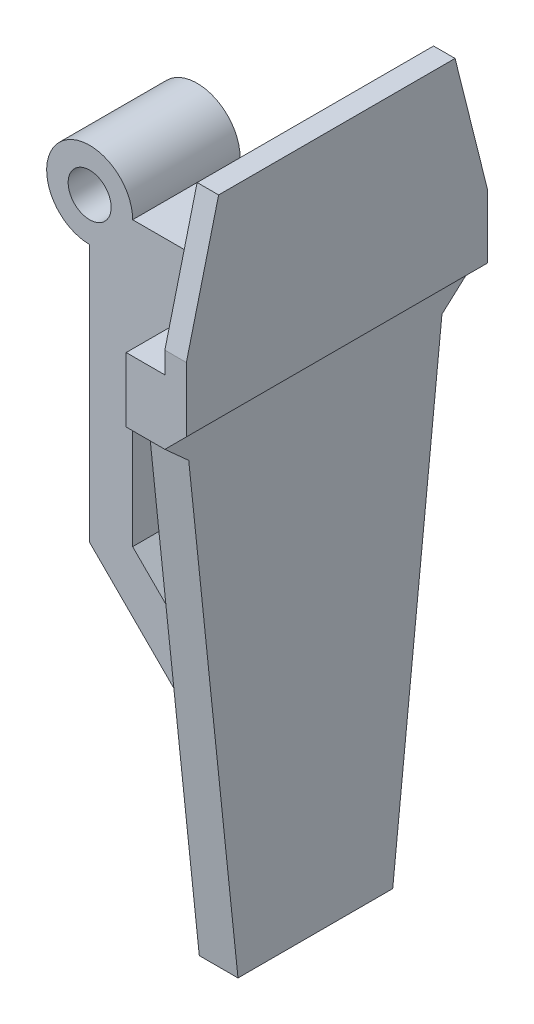
ISO-10303-21;
HEADER;
FILE_DESCRIPTION(('STEP AP214'),'2;1');
FILE_NAME('part.step','',(''),(''),'','','');
FILE_SCHEMA(('AUTOMOTIVE_DESIGN { 1 0 10303 214 1 1 1 1 }'));
ENDSEC;
DATA;
#1=APPLICATION_CONTEXT('core data for automotive mechanical design processes');
#2=APPLICATION_PROTOCOL_DEFINITION('international standard','automotive_design',2000,#1);
#3=PRODUCT_CONTEXT('',#1,'mechanical');
#4=PRODUCT('Part','Part','',(#3));
#5=PRODUCT_RELATED_PRODUCT_CATEGORY('part','',(#4));
#6=PRODUCT_DEFINITION_FORMATION('','',#4);
#7=PRODUCT_DEFINITION_CONTEXT('part definition',#1,'design');
#8=PRODUCT_DEFINITION('design','',#6,#7);
#9=PRODUCT_DEFINITION_SHAPE('','',#8);
#10=(LENGTH_UNIT() NAMED_UNIT(*) SI_UNIT(.MILLI.,.METRE.));
#11=(NAMED_UNIT(*) PLANE_ANGLE_UNIT() SI_UNIT($,.RADIAN.));
#12=(NAMED_UNIT(*) SI_UNIT($,.STERADIAN.) SOLID_ANGLE_UNIT());
#13=UNCERTAINTY_MEASURE_WITH_UNIT(LENGTH_MEASURE(1.E-05),#10,'distance_accuracy_value','');
#14=(GEOMETRIC_REPRESENTATION_CONTEXT(3) GLOBAL_UNCERTAINTY_ASSIGNED_CONTEXT((#13)) GLOBAL_UNIT_ASSIGNED_CONTEXT((#10,
#11,#12)) REPRESENTATION_CONTEXT('',''));
#15=CARTESIAN_POINT('',(0.,0.,0.));
#16=DIRECTION('',(0.,0.,1.));
#17=DIRECTION('',(1.,0.,0.));
#18=AXIS2_PLACEMENT_3D('',#15,#16,#17);
#19=CARTESIAN_POINT('',(60.4884324048631,0.,0.));
#20=DIRECTION('',(-1.,0.,0.));
#21=DIRECTION('',(0.,0.,1.));
#22=AXIS2_PLACEMENT_3D('',#19,#20,#21);
#23=PLANE('',#22);
#24=DIRECTION('',(0.,-1.,0.));
#25=VECTOR('',#24,1.);
#26=CARTESIAN_POINT('',(60.4884324048631,0.,-7.00000000000001));
#27=LINE('',#26,#25);
#28=CARTESIAN_POINT('',(60.4884324048631,-0.279472225827047,-7.00000000000001));
#29=VERTEX_POINT('',#28);
#30=CARTESIAN_POINT('',(60.4884324048631,-3.27947222582705,-7.00000000000001));
#31=VERTEX_POINT('',#30);
#32=EDGE_CURVE('E342',#29,#31,#27,.T.);
#33=ORIENTED_EDGE('',*,*,#32,.T.);
#34=DIRECTION('',(0.,-0.669475136110574,0.742834464823576));
#35=VECTOR('',#34,1.);
#36=CARTESIAN_POINT('',(60.4884324048631,-5.29078718190904,-4.7682904287187));
#37=LINE('',#36,#35);
#38=CARTESIAN_POINT('',(60.4884324048631,-4.27947222582705,-5.89042262399887));
#39=VERTEX_POINT('',#38);
#40=EDGE_CURVE('E490',#31,#39,#37,.T.);
#41=ORIENTED_EDGE('',*,*,#40,.T.);
#42=DIRECTION('',(0.,-0.994618408890778,0.103606084259456));
#43=VECTOR('',#42,1.);
#44=CARTESIAN_POINT('',(60.4884324048631,-0.652936125120399,-6.26818680115581));
#45=LINE('',#44,#43);
#46=CARTESIAN_POINT('',(60.4884324048631,-26.279472225827,-3.5987559573322));
#47=VERTEX_POINT('',#46);
#48=EDGE_CURVE('E493',#39,#47,#45,.T.);
#49=ORIENTED_EDGE('',*,*,#48,.T.);
#50=DIRECTION('',(0.,0.,1.));
#51=VECTOR('',#50,1.);
#52=CARTESIAN_POINT('',(60.4884324048631,-26.279472225827,0.));
#53=LINE('',#52,#51);
#54=CARTESIAN_POINT('',(60.4884324048631,-26.279472225827,3.5987559573322));
#55=VERTEX_POINT('',#54);
#56=EDGE_CURVE('E496',#47,#55,#53,.T.);
#57=ORIENTED_EDGE('',*,*,#56,.T.);
#58=DIRECTION('',(0.,0.994618408890778,0.103606084259456));
#59=VECTOR('',#58,1.);
#60=CARTESIAN_POINT('',(60.4884324048631,-0.652936125120396,6.2681868011558));
#61=LINE('',#60,#59);
#62=CARTESIAN_POINT('',(60.4884324048631,-4.27947222582705,5.89042262399886));
#63=VERTEX_POINT('',#62);
#64=EDGE_CURVE('E499',#55,#63,#61,.T.);
#65=ORIENTED_EDGE('',*,*,#64,.T.);
#66=DIRECTION('',(0.,-0.669475136110574,-0.742834464823576));
#67=VECTOR('',#66,1.);
#68=CARTESIAN_POINT('',(60.4884324048631,-5.29078718190904,4.7682904287187));
#69=LINE('',#68,#67);
#70=CARTESIAN_POINT('',(60.4884324048631,-3.27947222582705,7.));
#71=VERTEX_POINT('',#70);
#72=EDGE_CURVE('E482',#71,#63,#69,.T.);
#73=ORIENTED_EDGE('',*,*,#72,.F.);
#74=DIRECTION('',(0.,1.,0.));
#75=VECTOR('',#74,1.);
#76=CARTESIAN_POINT('',(60.4884324048631,0.,6.99999999999999));
#77=LINE('',#76,#75);
#78=CARTESIAN_POINT('',(60.4884324048631,-0.279472225827047,6.99999999999999));
#79=VERTEX_POINT('',#78);
#80=EDGE_CURVE('E346',#71,#79,#77,.T.);
#81=ORIENTED_EDGE('',*,*,#80,.T.);
#82=DIRECTION('',(0.,0.,1.));
#83=VECTOR('',#82,1.);
#84=CARTESIAN_POINT('',(60.4884324048631,-0.279472225827047,0.));
#85=LINE('',#84,#83);
#86=CARTESIAN_POINT('',(60.4884324048631,-0.279472225827047,2.5));
#87=VERTEX_POINT('',#86);
#88=EDGE_CURVE('E343',#87,#79,#85,.T.);
#89=ORIENTED_EDGE('',*,*,#88,.F.);
#90=DIRECTION('',(0.,-1.,0.));
#91=VECTOR('',#90,1.);
#92=CARTESIAN_POINT('',(60.4884324048631,0.,2.5));
#93=LINE('',#92,#91);
#94=CARTESIAN_POINT('',(60.4884324048631,-19.479472225827,2.5));
#95=VERTEX_POINT('',#94);
#96=EDGE_CURVE('E364',#87,#95,#93,.T.);
#97=ORIENTED_EDGE('',*,*,#96,.T.);
#98=DIRECTION('',(0.,0.,1.));
#99=VECTOR('',#98,1.);
#100=CARTESIAN_POINT('',(60.4884324048631,-19.479472225827,2.5));
#101=LINE('',#100,#99);
#102=CARTESIAN_POINT('',(60.4884324048631,-19.479472225827,-2.5));
#103=VERTEX_POINT('',#102);
#104=EDGE_CURVE('E361',#103,#95,#101,.T.);
#105=ORIENTED_EDGE('',*,*,#104,.F.);
#106=DIRECTION('',(0.,-1.,0.));
#107=VECTOR('',#106,1.);
#108=CARTESIAN_POINT('',(60.4884324048631,0.,-2.5));
#109=LINE('',#108,#107);
#110=CARTESIAN_POINT('',(60.4884324048631,-0.279472225827047,-2.5));
#111=VERTEX_POINT('',#110);
#112=EDGE_CURVE('E443',#111,#103,#109,.T.);
#113=ORIENTED_EDGE('',*,*,#112,.F.);
#114=EDGE_CURVE('E339',#29,#111,#85,.T.);
#115=ORIENTED_EDGE('',*,*,#114,.F.);
#116=EDGE_LOOP('',(#33,#41,#49,#57,#65,#73,#81,#89,#97,#105,#113,#115));
#117=FACE_BOUND('',#116,.T.);
#118=ADVANCED_FACE('F143',(#117),#23,.T.);
#119=CARTESIAN_POINT('',(62.2884324048631,-27.279472225827,-7.00000000000001));
#120=DIRECTION('',(-1.,0.,0.));
#121=DIRECTION('',(0.,0.,1.));
#122=AXIS2_PLACEMENT_3D('',#119,#120,#121);
#123=PLANE('',#122);
#124=DIRECTION('',(0.,0.669475136110574,-0.742834464823576));
#125=VECTOR('',#124,1.);
#126=CARTESIAN_POINT('',(62.2884324048631,-5.29078718190904,-4.7682904287187));
#127=LINE('',#126,#125);
#128=CARTESIAN_POINT('',(62.2884324048631,-4.27947222582705,-5.89042262399887));
#129=VERTEX_POINT('',#128);
#130=CARTESIAN_POINT('',(62.2884324048631,-3.27947222582705,-7.00000000000001));
#131=VERTEX_POINT('',#130);
#132=EDGE_CURVE('E470',#129,#131,#127,.T.);
#133=ORIENTED_EDGE('',*,*,#132,.T.);
#134=DIRECTION('',(0.,0.,1.));
#135=VECTOR('',#134,1.);
#136=CARTESIAN_POINT('',(62.2884324048631,-3.27947222582705,-7.00000000000001));
#137=LINE('',#136,#135);
#138=CARTESIAN_POINT('',(62.2884324048631,-3.27947222582705,7.));
#139=VERTEX_POINT('',#138);
#140=EDGE_CURVE('E332',#131,#139,#137,.T.);
#141=ORIENTED_EDGE('',*,*,#140,.T.);
#142=DIRECTION('',(0.,0.669475136110574,0.742834464823576));
#143=VECTOR('',#142,1.);
#144=CARTESIAN_POINT('',(62.2884324048631,-5.29078718190904,4.7682904287187));
#145=LINE('',#144,#143);
#146=CARTESIAN_POINT('',(62.2884324048631,-4.27947222582705,5.89042262399886));
#147=VERTEX_POINT('',#146);
#148=EDGE_CURVE('E464',#147,#139,#145,.T.);
#149=ORIENTED_EDGE('',*,*,#148,.F.);
#150=DIRECTION('',(0.,-0.994618408890778,-0.103606084259456));
#151=VECTOR('',#150,1.);
#152=CARTESIAN_POINT('',(62.2884324048631,-0.652936125120396,6.2681868011558));
#153=LINE('',#152,#151);
#154=CARTESIAN_POINT('',(62.2884324048631,-26.279472225827,3.5987559573322));
#155=VERTEX_POINT('',#154);
#156=EDGE_CURVE('E460',#147,#155,#153,.T.);
#157=ORIENTED_EDGE('',*,*,#156,.T.);
#158=DIRECTION('',(0.,0.,-1.));
#159=VECTOR('',#158,1.);
#160=CARTESIAN_POINT('',(62.2884324048631,-26.279472225827,0.));
#161=LINE('',#160,#159);
#162=CARTESIAN_POINT('',(62.2884324048631,-26.279472225827,-3.5987559573322));
#163=VERTEX_POINT('',#162);
#164=EDGE_CURVE('E476',#155,#163,#161,.T.);
#165=ORIENTED_EDGE('',*,*,#164,.T.);
#166=DIRECTION('',(0.,0.994618408890778,-0.103606084259456));
#167=VECTOR('',#166,1.);
#168=CARTESIAN_POINT('',(62.2884324048631,-0.652936125120399,-6.26818680115581));
#169=LINE('',#168,#167);
#170=EDGE_CURVE('E473',#163,#129,#169,.T.);
#171=ORIENTED_EDGE('',*,*,#170,.T.);
#172=EDGE_LOOP('',(#133,#141,#149,#157,#165,#171));
#173=FACE_BOUND('',#172,.T.);
#174=ADVANCED_FACE('F527',(#173),#123,.F.);
#175=CARTESIAN_POINT('',(0.,0.,2.5));
#176=DIRECTION('',(0.,0.,1.));
#177=DIRECTION('',(1.,0.,0.));
#178=AXIS2_PLACEMENT_3D('',#175,#176,#177);
#179=PLANE('',#178);
#180=CARTESIAN_POINT('',(54.2884324048631,0.720527774172953,2.5));
#181=DIRECTION('',(0.,0.,1.));
#182=DIRECTION('',(1.,0.,0.));
#183=AXIS2_PLACEMENT_3D('',#180,#181,#182);
#184=CIRCLE('',#183,0.999999999999998);
#185=CARTESIAN_POINT('',(55.2884324048631,0.720527774172953,2.5));
#186=VERTEX_POINT('',#185);
#187=EDGE_CURVE('E543',#186,#186,#184,.T.);
#188=ORIENTED_EDGE('',*,*,#187,.F.);
#189=EDGE_LOOP('',(#188));
#190=FACE_BOUND('',#189,.T.);
#191=DIRECTION('',(-1.,0.,0.));
#192=VECTOR('',#191,1.);
#193=CARTESIAN_POINT('',(0.,-0.279472225827047,2.5));
#194=LINE('',#193,#192);
#195=CARTESIAN_POINT('',(62.2884324048631,-0.279472225827047,2.5));
#196=VERTEX_POINT('',#195);
#197=EDGE_CURVE('E359',#196,#87,#194,.T.);
#198=ORIENTED_EDGE('',*,*,#197,.F.);
#199=DIRECTION('',(0.,-1.,0.));
#200=VECTOR('',#199,1.);
#201=CARTESIAN_POINT('',(62.2884324048631,0.720527774172953,2.5));
#202=LINE('',#201,#200);
#203=CARTESIAN_POINT('',(62.2884324048631,0.720527774172953,2.5));
#204=VERTEX_POINT('',#203);
#205=EDGE_CURVE('E417',#204,#196,#202,.T.);
#206=ORIENTED_EDGE('',*,*,#205,.F.);
#207=DIRECTION('',(1.,0.,0.));
#208=VECTOR('',#207,1.);
#209=CARTESIAN_POINT('',(54.2884324048631,0.720527774172953,2.5));
#210=LINE('',#209,#208);
#211=CARTESIAN_POINT('',(56.2884324048631,0.720527774172953,2.5));
#212=VERTEX_POINT('',#211);
#213=EDGE_CURVE('E414',#212,#204,#210,.T.);
#214=ORIENTED_EDGE('',*,*,#213,.F.);
#215=CARTESIAN_POINT('',(54.2884324048631,0.720527774172953,2.5));
#216=DIRECTION('',(0.,0.,1.));
#217=DIRECTION('',(1.,0.,0.));
#218=AXIS2_PLACEMENT_3D('',#215,#216,#217);
#219=CIRCLE('',#218,2.);
#220=CARTESIAN_POINT('',(54.2884324048631,-1.27947222582705,2.5));
#221=VERTEX_POINT('',#220);
#222=EDGE_CURVE('E429',#212,#221,#219,.T.);
#223=ORIENTED_EDGE('',*,*,#222,.T.);
#224=DIRECTION('',(0.,-1.,0.));
#225=VECTOR('',#224,1.);
#226=CARTESIAN_POINT('',(54.2884324048631,0.720527774172953,2.5));
#227=LINE('',#226,#225);
#228=CARTESIAN_POINT('',(54.2884324048631,-13.279472225827,2.5));
#229=VERTEX_POINT('',#228);
#230=EDGE_CURVE('E423',#221,#229,#227,.T.);
#231=ORIENTED_EDGE('',*,*,#230,.T.);
#232=DIRECTION('',(0.707106781186548,-0.707106781186548,0.));
#233=VECTOR('',#232,1.);
#234=CARTESIAN_POINT('',(54.2884324048631,-13.279472225827,2.5));
#235=LINE('',#234,#233);
#236=EDGE_CURVE('E420',#229,#95,#235,.T.);
#237=ORIENTED_EDGE('',*,*,#236,.T.);
#238=ORIENTED_EDGE('',*,*,#96,.F.);
#239=EDGE_LOOP('',(#198,#206,#214,#223,#231,#237,#238));
#240=FACE_BOUND('',#239,.T.);
#241=DIRECTION('',(-0.707106781186552,-0.707106781186543,0.));
#242=VECTOR('',#241,1.);
#243=CARTESIAN_POINT('',(60.2884324048631,-1.27947222582705,2.5));
#244=LINE('',#243,#242);
#245=CARTESIAN_POINT('',(60.2884324048631,-1.27947222582705,2.5));
#246=VERTEX_POINT('',#245);
#247=CARTESIAN_POINT('',(56.2884324048631,-5.27947222582699,2.5));
#248=VERTEX_POINT('',#247);
#249=EDGE_CURVE('E397',#246,#248,#244,.T.);
#250=ORIENTED_EDGE('',*,*,#249,.F.);
#251=DIRECTION('',(0.,1.,0.));
#252=VECTOR('',#251,1.);
#253=CARTESIAN_POINT('',(60.2884324048631,-16.4510451010809,2.5));
#254=LINE('',#253,#252);
#255=CARTESIAN_POINT('',(60.2884324048631,-16.4510451010809,2.5));
#256=VERTEX_POINT('',#255);
#257=EDGE_CURVE('E404',#256,#246,#254,.T.);
#258=ORIENTED_EDGE('',*,*,#257,.F.);
#259=DIRECTION('',(0.707106781186548,-0.707106781186547,0.));
#260=VECTOR('',#259,1.);
#261=CARTESIAN_POINT('',(56.2884324048631,-12.4510451010809,2.5));
#262=LINE('',#261,#260);
#263=CARTESIAN_POINT('',(56.2884324048631,-12.4510451010809,2.5));
#264=VERTEX_POINT('',#263);
#265=EDGE_CURVE('E401',#264,#256,#262,.T.);
#266=ORIENTED_EDGE('',*,*,#265,.F.);
#267=DIRECTION('',(0.,-1.,0.));
#268=VECTOR('',#267,1.);
#269=CARTESIAN_POINT('',(56.2884324048631,-5.27947222582699,2.5));
#270=LINE('',#269,#268);
#271=EDGE_CURVE('E399',#248,#264,#270,.T.);
#272=ORIENTED_EDGE('',*,*,#271,.F.);
#273=EDGE_LOOP('',(#250,#258,#266,#272));
#274=FACE_BOUND('',#273,.T.);
#275=ADVANCED_FACE('F563',(#190,#240,#274),#179,.T.);
#276=CARTESIAN_POINT('',(54.2884324048631,0.720527774172953,2.5));
#277=DIRECTION('',(0.,1.,0.));
#278=DIRECTION('',(0.,0.,1.));
#279=AXIS2_PLACEMENT_3D('',#276,#277,#278);
#280=PLANE('',#279);
#281=DIRECTION('',(1.,0.,0.));
#282=VECTOR('',#281,1.);
#283=CARTESIAN_POINT('',(54.2884324048631,0.720527774172953,-2.5));
#284=LINE('',#283,#282);
#285=CARTESIAN_POINT('',(56.2884324048631,0.720527774172953,-2.5));
#286=VERTEX_POINT('',#285);
#287=CARTESIAN_POINT('',(62.2884324048631,0.720527774172953,-2.5));
#288=VERTEX_POINT('',#287);
#289=EDGE_CURVE('E386',#286,#288,#284,.T.);
#290=ORIENTED_EDGE('',*,*,#289,.F.);
#291=DIRECTION('',(0.,0.,1.));
#292=VECTOR('',#291,1.);
#293=CARTESIAN_POINT('',(56.2884324048631,0.720527774172953,-2.5));
#294=LINE('',#293,#292);
#295=EDGE_CURVE('E436',#286,#212,#294,.T.);
#296=ORIENTED_EDGE('',*,*,#295,.T.);
#297=ORIENTED_EDGE('',*,*,#213,.T.);
#298=DIRECTION('',(0.,0.,-1.));
#299=VECTOR('',#298,1.);
#300=CARTESIAN_POINT('',(62.2884324048631,0.720527774172953,2.5));
#301=LINE('',#300,#299);
#302=EDGE_CURVE('E425',#204,#288,#301,.T.);
#303=ORIENTED_EDGE('',*,*,#302,.T.);
#304=EDGE_LOOP('',(#290,#296,#297,#303));
#305=FACE_BOUND('',#304,.T.);
#306=ADVANCED_FACE('F598',(#305),#280,.T.);
#307=CARTESIAN_POINT('',(54.2884324048631,0.720527774172953,2.5));
#308=DIRECTION('',(1.,0.,0.));
#309=DIRECTION('',(0.,0.,-1.));
#310=AXIS2_PLACEMENT_3D('',#307,#308,#309);
#311=PLANE('',#310);
#312=DIRECTION('',(0.,0.,1.));
#313=VECTOR('',#312,1.);
#314=CARTESIAN_POINT('',(54.2884324048631,-1.27947222582705,-2.5));
#315=LINE('',#314,#313);
#316=CARTESIAN_POINT('',(54.2884324048631,-1.27947222582705,-2.5));
#317=VERTEX_POINT('',#316);
#318=EDGE_CURVE('E437',#317,#221,#315,.T.);
#319=ORIENTED_EDGE('',*,*,#318,.F.);
#320=DIRECTION('',(0.,-1.,0.));
#321=VECTOR('',#320,1.);
#322=CARTESIAN_POINT('',(54.2884324048631,0.720527774172953,-2.5));
#323=LINE('',#322,#321);
#324=CARTESIAN_POINT('',(54.2884324048631,-13.279472225827,-2.5));
#325=VERTEX_POINT('',#324);
#326=EDGE_CURVE('E395',#317,#325,#323,.T.);
#327=ORIENTED_EDGE('',*,*,#326,.T.);
#328=DIRECTION('',(0.,0.,-1.));
#329=VECTOR('',#328,1.);
#330=CARTESIAN_POINT('',(54.2884324048631,-13.279472225827,2.5));
#331=LINE('',#330,#329);
#332=EDGE_CURVE('E426',#229,#325,#331,.T.);
#333=ORIENTED_EDGE('',*,*,#332,.F.);
#334=ORIENTED_EDGE('',*,*,#230,.F.);
#335=EDGE_LOOP('',(#319,#327,#333,#334));
#336=FACE_BOUND('',#335,.T.);
#337=ADVANCED_FACE('F595',(#336),#311,.F.);
#338=CARTESIAN_POINT('',(54.2884324048631,-13.279472225827,2.5));
#339=DIRECTION('',(0.707106781186548,0.707106781186548,0.));
#340=DIRECTION('',(-0.707106781186548,0.707106781186548,0.));
#341=AXIS2_PLACEMENT_3D('',#338,#339,#340);
#342=PLANE('',#341);
#343=DIRECTION('',(0.707106781186548,-0.707106781186548,0.));
#344=VECTOR('',#343,1.);
#345=CARTESIAN_POINT('',(54.2884324048631,-13.279472225827,-2.5));
#346=LINE('',#345,#344);
#347=EDGE_CURVE('E392',#325,#103,#346,.T.);
#348=ORIENTED_EDGE('',*,*,#347,.T.);
#349=ORIENTED_EDGE('',*,*,#104,.T.);
#350=ORIENTED_EDGE('',*,*,#236,.F.);
#351=ORIENTED_EDGE('',*,*,#332,.T.);
#352=EDGE_LOOP('',(#348,#349,#350,#351));
#353=FACE_BOUND('',#352,.T.);
#354=ADVANCED_FACE('F593',(#353),#342,.F.);
#355=CARTESIAN_POINT('',(60.2884324048631,-1.27947222582705,2.5));
#356=DIRECTION('',(0.707106781186543,-0.707106781186552,0.));
#357=DIRECTION('',(0.707106781186552,0.707106781186543,0.));
#358=AXIS2_PLACEMENT_3D('',#355,#356,#357);
#359=PLANE('',#358);
#360=DIRECTION('',(0.,0.,-1.));
#361=VECTOR('',#360,1.);
#362=CARTESIAN_POINT('',(56.2884324048631,-5.27947222582699,2.5));
#363=LINE('',#362,#361);
#364=CARTESIAN_POINT('',(56.2884324048631,-5.27947222582699,-2.5));
#365=VERTEX_POINT('',#364);
#366=EDGE_CURVE('E412',#248,#365,#363,.T.);
#367=ORIENTED_EDGE('',*,*,#366,.T.);
#368=DIRECTION('',(-0.707106781186552,-0.707106781186543,0.));
#369=VECTOR('',#368,1.);
#370=CARTESIAN_POINT('',(60.2884324048631,-1.27947222582705,-2.5));
#371=LINE('',#370,#369);
#372=CARTESIAN_POINT('',(60.2884324048631,-1.27947222582705,-2.5));
#373=VERTEX_POINT('',#372);
#374=EDGE_CURVE('E374',#373,#365,#371,.T.);
#375=ORIENTED_EDGE('',*,*,#374,.F.);
#376=DIRECTION('',(0.,0.,-1.));
#377=VECTOR('',#376,1.);
#378=CARTESIAN_POINT('',(60.2884324048631,-1.27947222582705,2.5));
#379=LINE('',#378,#377);
#380=EDGE_CURVE('E406',#246,#373,#379,.T.);
#381=ORIENTED_EDGE('',*,*,#380,.F.);
#382=ORIENTED_EDGE('',*,*,#249,.T.);
#383=EDGE_LOOP('',(#367,#375,#381,#382));
#384=FACE_BOUND('',#383,.T.);
#385=ADVANCED_FACE('F589',(#384),#359,.T.);
#386=CARTESIAN_POINT('',(56.2884324048631,-5.27947222582699,2.5));
#387=DIRECTION('',(1.,0.,0.));
#388=DIRECTION('',(0.,0.,-1.));
#389=AXIS2_PLACEMENT_3D('',#386,#387,#388);
#390=PLANE('',#389);
#391=DIRECTION('',(0.,0.,-1.));
#392=VECTOR('',#391,1.);
#393=CARTESIAN_POINT('',(56.2884324048631,-12.4510451010809,2.5));
#394=LINE('',#393,#392);
#395=CARTESIAN_POINT('',(56.2884324048631,-12.4510451010809,-2.5));
#396=VERTEX_POINT('',#395);
#397=EDGE_CURVE('E410',#264,#396,#394,.T.);
#398=ORIENTED_EDGE('',*,*,#397,.T.);
#399=DIRECTION('',(0.,-1.,0.));
#400=VECTOR('',#399,1.);
#401=CARTESIAN_POINT('',(56.2884324048631,-5.27947222582699,-2.5));
#402=LINE('',#401,#400);
#403=EDGE_CURVE('E377',#365,#396,#402,.T.);
#404=ORIENTED_EDGE('',*,*,#403,.F.);
#405=ORIENTED_EDGE('',*,*,#366,.F.);
#406=ORIENTED_EDGE('',*,*,#271,.T.);
#407=EDGE_LOOP('',(#398,#404,#405,#406));
#408=FACE_BOUND('',#407,.T.);
#409=ADVANCED_FACE('F585',(#408),#390,.T.);
#410=CARTESIAN_POINT('',(56.2884324048631,-12.4510451010809,2.5));
#411=DIRECTION('',(0.707106781186547,0.707106781186548,0.));
#412=DIRECTION('',(-0.707106781186548,0.707106781186547,0.));
#413=AXIS2_PLACEMENT_3D('',#410,#411,#412);
#414=PLANE('',#413);
#415=DIRECTION('',(0.,0.,-1.));
#416=VECTOR('',#415,1.);
#417=CARTESIAN_POINT('',(60.2884324048631,-16.4510451010809,2.5));
#418=LINE('',#417,#416);
#419=CARTESIAN_POINT('',(60.2884324048631,-16.4510451010809,-2.5));
#420=VERTEX_POINT('',#419);
#421=EDGE_CURVE('E408',#256,#420,#418,.T.);
#422=ORIENTED_EDGE('',*,*,#421,.T.);
#423=DIRECTION('',(0.707106781186548,-0.707106781186547,0.));
#424=VECTOR('',#423,1.);
#425=CARTESIAN_POINT('',(56.2884324048631,-12.4510451010809,-2.5));
#426=LINE('',#425,#424);
#427=EDGE_CURVE('E380',#396,#420,#426,.T.);
#428=ORIENTED_EDGE('',*,*,#427,.F.);
#429=ORIENTED_EDGE('',*,*,#397,.F.);
#430=ORIENTED_EDGE('',*,*,#265,.T.);
#431=EDGE_LOOP('',(#422,#428,#429,#430));
#432=FACE_BOUND('',#431,.T.);
#433=ADVANCED_FACE('F581',(#432),#414,.T.);
#434=CARTESIAN_POINT('',(60.2884324048631,-1.27947222582705,2.5));
#435=DIRECTION('',(1.,0.,0.));
#436=DIRECTION('',(0.,0.,-1.));
#437=AXIS2_PLACEMENT_3D('',#434,#435,#436);
#438=PLANE('',#437);
#439=ORIENTED_EDGE('',*,*,#380,.T.);
#440=DIRECTION('',(0.,1.,0.));
#441=VECTOR('',#440,1.);
#442=CARTESIAN_POINT('',(60.2884324048631,-16.4510451010809,-2.5));
#443=LINE('',#442,#441);
#444=EDGE_CURVE('E383',#420,#373,#443,.T.);
#445=ORIENTED_EDGE('',*,*,#444,.F.);
#446=ORIENTED_EDGE('',*,*,#421,.F.);
#447=ORIENTED_EDGE('',*,*,#257,.T.);
#448=EDGE_LOOP('',(#439,#445,#446,#447));
#449=FACE_BOUND('',#448,.T.);
#450=ADVANCED_FACE('F578',(#449),#438,.F.);
#451=CARTESIAN_POINT('',(54.2884324048631,0.720527774172953,-2.5));
#452=DIRECTION('',(0.,0.,1.));
#453=DIRECTION('',(1.,0.,0.));
#454=AXIS2_PLACEMENT_3D('',#451,#452,#453);
#455=CYLINDRICAL_SURFACE('',#454,2.);
#456=ORIENTED_EDGE('',*,*,#318,.T.);
#457=ORIENTED_EDGE('',*,*,#222,.F.);
#458=ORIENTED_EDGE('',*,*,#295,.F.);
#459=CARTESIAN_POINT('',(54.2884324048631,0.720527774172953,-2.5));
#460=DIRECTION('',(0.,0.,1.));
#461=DIRECTION('',(1.,0.,0.));
#462=AXIS2_PLACEMENT_3D('',#459,#460,#461);
#463=CIRCLE('',#462,2.);
#464=EDGE_CURVE('E434',#286,#317,#463,.T.);
#465=ORIENTED_EDGE('',*,*,#464,.T.);
#466=EDGE_LOOP('',(#456,#457,#458,#465));
#467=FACE_BOUND('',#466,.T.);
#468=ADVANCED_FACE('F145',(#467),#455,.T.);
#469=CARTESIAN_POINT('',(0.,0.,-2.5));
#470=DIRECTION('',(0.,0.,1.));
#471=DIRECTION('',(1.,0.,0.));
#472=AXIS2_PLACEMENT_3D('',#469,#470,#471);
#473=PLANE('',#472);
#474=CARTESIAN_POINT('',(54.2884324048631,0.720527774172953,-2.5));
#475=DIRECTION('',(0.,0.,1.));
#476=DIRECTION('',(1.,0.,0.));
#477=AXIS2_PLACEMENT_3D('',#474,#475,#476);
#478=CIRCLE('',#477,0.999999999999998);
#479=CARTESIAN_POINT('',(55.2884324048631,0.720527774172953,-2.5));
#480=VERTEX_POINT('',#479);
#481=EDGE_CURVE('E147',#480,#480,#478,.T.);
#482=ORIENTED_EDGE('',*,*,#481,.T.);
#483=EDGE_LOOP('',(#482));
#484=FACE_BOUND('',#483,.T.);
#485=DIRECTION('',(0.,-1.,0.));
#486=VECTOR('',#485,1.);
#487=CARTESIAN_POINT('',(62.2884324048631,0.720527774172953,-2.5));
#488=LINE('',#487,#486);
#489=CARTESIAN_POINT('',(62.2884324048631,-0.279472225827047,-2.5));
#490=VERTEX_POINT('',#489);
#491=EDGE_CURVE('E389',#288,#490,#488,.T.);
#492=ORIENTED_EDGE('',*,*,#491,.T.);
#493=DIRECTION('',(-1.,0.,0.));
#494=VECTOR('',#493,1.);
#495=CARTESIAN_POINT('',(0.,-0.279472225827047,-2.5));
#496=LINE('',#495,#494);
#497=EDGE_CURVE('E356',#490,#111,#496,.T.);
#498=ORIENTED_EDGE('',*,*,#497,.T.);
#499=ORIENTED_EDGE('',*,*,#112,.T.);
#500=ORIENTED_EDGE('',*,*,#347,.F.);
#501=ORIENTED_EDGE('',*,*,#326,.F.);
#502=ORIENTED_EDGE('',*,*,#464,.F.);
#503=ORIENTED_EDGE('',*,*,#289,.T.);
#504=EDGE_LOOP('',(#492,#498,#499,#500,#501,#502,#503));
#505=FACE_BOUND('',#504,.T.);
#506=ORIENTED_EDGE('',*,*,#374,.T.);
#507=ORIENTED_EDGE('',*,*,#403,.T.);
#508=ORIENTED_EDGE('',*,*,#427,.T.);
#509=ORIENTED_EDGE('',*,*,#444,.T.);
#510=EDGE_LOOP('',(#506,#507,#508,#509));
#511=FACE_BOUND('',#510,.T.);
#512=ADVANCED_FACE('F536',(#484,#505,#511),#473,.F.);
#513=CARTESIAN_POINT('',(65.2884324048631,8.72052777417295,7.));
#514=DIRECTION('',(0.,0.,-1.));
#515=DIRECTION('',(0.,1.,0.));
#516=AXIS2_PLACEMENT_3D('',#513,#514,#515);
#517=PLANE('',#516);
#518=DIRECTION('',(0.,-1.,0.));
#519=VECTOR('',#518,1.);
#520=CARTESIAN_POINT('',(63.2884324048631,-2.27947222582705,7.));
#521=LINE('',#520,#519);
#522=CARTESIAN_POINT('',(63.2884324048631,0.720527774172953,7.));
#523=VERTEX_POINT('',#522);
#524=CARTESIAN_POINT('',(63.2884324048631,-2.27947222582705,7.));
#525=VERTEX_POINT('',#524);
#526=EDGE_CURVE('E328',#523,#525,#521,.T.);
#527=ORIENTED_EDGE('',*,*,#526,.F.);
#528=DIRECTION('',(1.,0.,0.));
#529=VECTOR('',#528,1.);
#530=CARTESIAN_POINT('',(53.2884324048631,0.720527774172953,7.));
#531=LINE('',#530,#529);
#532=CARTESIAN_POINT('',(62.2884324048631,0.720527774172953,7.));
#533=VERTEX_POINT('',#532);
#534=EDGE_CURVE('E461',#533,#523,#531,.T.);
#535=ORIENTED_EDGE('',*,*,#534,.F.);
#536=DIRECTION('',(0.,-1.,0.));
#537=VECTOR('',#536,1.);
#538=CARTESIAN_POINT('',(62.2884324048631,8.72052777417295,7.));
#539=LINE('',#538,#537);
#540=CARTESIAN_POINT('',(62.2884324048631,-0.279472225827047,6.99999999999999));
#541=VERTEX_POINT('',#540);
#542=EDGE_CURVE('E366',#533,#541,#539,.T.);
#543=ORIENTED_EDGE('',*,*,#542,.T.);
#544=DIRECTION('',(1.,0.,0.));
#545=VECTOR('',#544,1.);
#546=CARTESIAN_POINT('',(60.4884324048631,-0.279472225827047,6.99999999999999));
#547=LINE('',#546,#545);
#548=EDGE_CURVE('E349',#79,#541,#547,.T.);
#549=ORIENTED_EDGE('',*,*,#548,.F.);
#550=ORIENTED_EDGE('',*,*,#80,.F.);
#551=DIRECTION('',(-1.,0.,0.));
#552=VECTOR('',#551,1.);
#553=CARTESIAN_POINT('',(65.2884324048631,-3.27947222582705,7.));
#554=LINE('',#553,#552);
#555=EDGE_CURVE('E372',#139,#71,#554,.T.);
#556=ORIENTED_EDGE('',*,*,#555,.F.);
#557=DIRECTION('',(-0.707106781186549,-0.707106781186546,0.));
#558=VECTOR('',#557,1.);
#559=CARTESIAN_POINT('',(62.2884324048631,-3.27947222582705,7.));
#560=LINE('',#559,#558);
#561=EDGE_CURVE('E323',#525,#139,#560,.T.);
#562=ORIENTED_EDGE('',*,*,#561,.F.);
#563=EDGE_LOOP('',(#527,#535,#543,#549,#550,#556,#562));
#564=FACE_BOUND('',#563,.T.);
#565=ADVANCED_FACE('F508',(#564),#517,.F.);
#566=CARTESIAN_POINT('',(65.2884324048631,8.72052777417295,-7.));
#567=DIRECTION('',(0.,0.,-1.));
#568=DIRECTION('',(0.,1.,0.));
#569=AXIS2_PLACEMENT_3D('',#566,#567,#568);
#570=PLANE('',#569);
#571=DIRECTION('',(1.,0.,0.));
#572=VECTOR('',#571,1.);
#573=CARTESIAN_POINT('',(53.2884324048631,0.720527774172953,-7.00000000000001));
#574=LINE('',#573,#572);
#575=CARTESIAN_POINT('',(62.2884324048631,0.720527774172953,-7.00000000000001));
#576=VERTEX_POINT('',#575);
#577=CARTESIAN_POINT('',(63.2884324048631,0.720527774172953,-7.00000000000001));
#578=VERTEX_POINT('',#577);
#579=EDGE_CURVE('E306',#576,#578,#574,.T.);
#580=ORIENTED_EDGE('',*,*,#579,.T.);
#581=DIRECTION('',(0.,-1.,0.));
#582=VECTOR('',#581,1.);
#583=CARTESIAN_POINT('',(63.2884324048631,-2.27947222582705,-7.00000000000001));
#584=LINE('',#583,#582);
#585=CARTESIAN_POINT('',(63.2884324048631,-2.27947222582705,-7.00000000000001));
#586=VERTEX_POINT('',#585);
#587=EDGE_CURVE('E313',#578,#586,#584,.T.);
#588=ORIENTED_EDGE('',*,*,#587,.T.);
#589=DIRECTION('',(-0.707106781186549,-0.707106781186546,0.));
#590=VECTOR('',#589,1.);
#591=CARTESIAN_POINT('',(62.2884324048631,-3.27947222582705,-7.00000000000001));
#592=LINE('',#591,#590);
#593=EDGE_CURVE('E322',#586,#131,#592,.T.);
#594=ORIENTED_EDGE('',*,*,#593,.T.);
#595=DIRECTION('',(-1.,0.,0.));
#596=VECTOR('',#595,1.);
#597=CARTESIAN_POINT('',(65.2884324048631,-3.27947222582705,-7.));
#598=LINE('',#597,#596);
#599=EDGE_CURVE('E369',#131,#31,#598,.T.);
#600=ORIENTED_EDGE('',*,*,#599,.T.);
#601=ORIENTED_EDGE('',*,*,#32,.F.);
#602=DIRECTION('',(1.,0.,0.));
#603=VECTOR('',#602,1.);
#604=CARTESIAN_POINT('',(60.4884324048631,-0.279472225827047,-7.00000000000001));
#605=LINE('',#604,#603);
#606=CARTESIAN_POINT('',(62.2884324048631,-0.279472225827047,-7.00000000000001));
#607=VERTEX_POINT('',#606);
#608=EDGE_CURVE('E354',#29,#607,#605,.T.);
#609=ORIENTED_EDGE('',*,*,#608,.T.);
#610=DIRECTION('',(0.,-1.,0.));
#611=VECTOR('',#610,1.);
#612=CARTESIAN_POINT('',(62.2884324048631,8.72052777417295,-7.));
#613=LINE('',#612,#611);
#614=EDGE_CURVE('E316',#576,#607,#613,.T.);
#615=ORIENTED_EDGE('',*,*,#614,.F.);
#616=EDGE_LOOP('',(#580,#588,#594,#600,#601,#609,#615));
#617=FACE_BOUND('',#616,.T.);
#618=ADVANCED_FACE('F311',(#617),#570,.T.);
#619=CARTESIAN_POINT('',(62.2884324048631,0.,0.));
#620=DIRECTION('',(1.,0.,0.));
#621=DIRECTION('',(0.,0.,-1.));
#622=AXIS2_PLACEMENT_3D('',#619,#620,#621);
#623=PLANE('',#622);
#624=DIRECTION('',(0.,0.,1.));
#625=VECTOR('',#624,1.);
#626=CARTESIAN_POINT('',(62.2884324048631,6.72052777417295,-7.00000000000001));
#627=LINE('',#626,#625);
#628=CARTESIAN_POINT('',(62.2884324048631,6.72052777417295,-5.50000000000001));
#629=VERTEX_POINT('',#628);
#630=CARTESIAN_POINT('',(62.2884324048631,6.72052777417295,5.5));
#631=VERTEX_POINT('',#630);
#632=EDGE_CURVE('E325',#629,#631,#627,.T.);
#633=ORIENTED_EDGE('',*,*,#632,.F.);
#634=DIRECTION('',(0.,-0.970142500145332,-0.242535625036333));
#635=VECTOR('',#634,1.);
#636=CARTESIAN_POINT('',(62.2884324048631,1.68944281024547,-6.75777124098188));
#637=LINE('',#636,#635);
#638=EDGE_CURVE('E159',#629,#576,#637,.T.);
#639=ORIENTED_EDGE('',*,*,#638,.T.);
#640=ORIENTED_EDGE('',*,*,#614,.T.);
#641=DIRECTION('',(0.,0.,1.));
#642=VECTOR('',#641,1.);
#643=CARTESIAN_POINT('',(62.2884324048631,-0.279472225827047,0.));
#644=LINE('',#643,#642);
#645=EDGE_CURVE('E335',#607,#490,#644,.T.);
#646=ORIENTED_EDGE('',*,*,#645,.T.);
#647=ORIENTED_EDGE('',*,*,#491,.F.);
#648=ORIENTED_EDGE('',*,*,#302,.F.);
#649=ORIENTED_EDGE('',*,*,#205,.T.);
#650=DIRECTION('',(0.,0.,1.));
#651=VECTOR('',#650,1.);
#652=CARTESIAN_POINT('',(62.2884324048631,-0.279472225827047,0.));
#653=LINE('',#652,#651);
#654=EDGE_CURVE('E439',#196,#541,#653,.T.);
#655=ORIENTED_EDGE('',*,*,#654,.T.);
#656=ORIENTED_EDGE('',*,*,#542,.F.);
#657=DIRECTION('',(0.,0.970142500145332,-0.242535625036333));
#658=VECTOR('',#657,1.);
#659=CARTESIAN_POINT('',(62.2884324048631,1.68944281024547,6.75777124098187));
#660=LINE('',#659,#658);
#661=EDGE_CURVE('E454',#533,#631,#660,.T.);
#662=ORIENTED_EDGE('',*,*,#661,.T.);
#663=EDGE_LOOP('',(#633,#639,#640,#646,#647,#648,#649,#655,#656,#662));
#664=FACE_BOUND('',#663,.T.);
#665=ADVANCED_FACE('F459',(#664),#623,.F.);
#666=CARTESIAN_POINT('',(60.4884324048631,-0.279472225827047,0.));
#667=DIRECTION('',(0.,1.,0.));
#668=DIRECTION('',(0.,0.,1.));
#669=AXIS2_PLACEMENT_3D('',#666,#667,#668);
#670=PLANE('',#669);
#671=ORIENTED_EDGE('',*,*,#497,.F.);
#672=ORIENTED_EDGE('',*,*,#645,.F.);
#673=ORIENTED_EDGE('',*,*,#608,.F.);
#674=ORIENTED_EDGE('',*,*,#114,.T.);
#675=EDGE_LOOP('',(#671,#672,#673,#674));
#676=FACE_BOUND('',#675,.T.);
#677=ADVANCED_FACE('F533',(#676),#670,.T.);
#678=ORIENTED_EDGE('',*,*,#654,.F.);
#679=ORIENTED_EDGE('',*,*,#197,.T.);
#680=ORIENTED_EDGE('',*,*,#88,.T.);
#681=ORIENTED_EDGE('',*,*,#548,.T.);
#682=EDGE_LOOP('',(#678,#679,#680,#681));
#683=FACE_BOUND('',#682,.T.);
#684=ADVANCED_FACE('F568',(#683),#670,.T.);
#685=CARTESIAN_POINT('',(62.2884324048631,-3.27947222582705,-7.00000000000001));
#686=DIRECTION('',(-0.707106781186546,0.707106781186549,0.));
#687=DIRECTION('',(-0.707106781186549,-0.707106781186546,0.));
#688=AXIS2_PLACEMENT_3D('',#685,#686,#687);
#689=PLANE('',#688);
#690=ORIENTED_EDGE('',*,*,#140,.F.);
#691=ORIENTED_EDGE('',*,*,#593,.F.);
#692=DIRECTION('',(0.,0.,1.));
#693=VECTOR('',#692,1.);
#694=CARTESIAN_POINT('',(63.2884324048631,-2.27947222582705,-7.00000000000001));
#695=LINE('',#694,#693);
#696=EDGE_CURVE('E320',#586,#525,#695,.T.);
#697=ORIENTED_EDGE('',*,*,#696,.T.);
#698=ORIENTED_EDGE('',*,*,#561,.T.);
#699=EDGE_LOOP('',(#690,#691,#697,#698));
#700=FACE_BOUND('',#699,.T.);
#701=ADVANCED_FACE('F506',(#700),#689,.F.);
#702=CARTESIAN_POINT('',(63.2884324048631,-2.27947222582705,-7.00000000000001));
#703=DIRECTION('',(-1.,0.,0.));
#704=DIRECTION('',(0.,0.,1.));
#705=AXIS2_PLACEMENT_3D('',#702,#703,#704);
#706=PLANE('',#705);
#707=ORIENTED_EDGE('',*,*,#587,.F.);
#708=DIRECTION('',(0.,-0.970142500145332,-0.242535625036333));
#709=VECTOR('',#708,1.);
#710=CARTESIAN_POINT('',(63.2884324048631,0.720527774172953,-7.00000000000001));
#711=LINE('',#710,#709);
#712=CARTESIAN_POINT('',(63.2884324048631,6.72052777417295,-5.50000000000001));
#713=VERTEX_POINT('',#712);
#714=EDGE_CURVE('E303',#713,#578,#711,.T.);
#715=ORIENTED_EDGE('',*,*,#714,.F.);
#716=DIRECTION('',(0.,0.,1.));
#717=VECTOR('',#716,1.);
#718=CARTESIAN_POINT('',(63.2884324048631,6.72052777417295,-7.00000000000001));
#719=LINE('',#718,#717);
#720=CARTESIAN_POINT('',(63.2884324048631,6.72052777417295,5.5));
#721=VERTEX_POINT('',#720);
#722=EDGE_CURVE('E166',#713,#721,#719,.T.);
#723=ORIENTED_EDGE('',*,*,#722,.T.);
#724=DIRECTION('',(0.,0.970142500145332,-0.242535625036333));
#725=VECTOR('',#724,1.);
#726=CARTESIAN_POINT('',(63.2884324048631,0.720527774172953,7.));
#727=LINE('',#726,#725);
#728=EDGE_CURVE('E456',#523,#721,#727,.T.);
#729=ORIENTED_EDGE('',*,*,#728,.F.);
#730=ORIENTED_EDGE('',*,*,#526,.T.);
#731=ORIENTED_EDGE('',*,*,#696,.F.);
#732=EDGE_LOOP('',(#707,#715,#723,#729,#730,#731));
#733=FACE_BOUND('',#732,.T.);
#734=ADVANCED_FACE('F318',(#733),#706,.F.);
#735=CARTESIAN_POINT('',(63.2884324048631,6.72052777417295,-7.00000000000001));
#736=DIRECTION('',(0.,-1.,0.));
#737=DIRECTION('',(0.,0.,-1.));
#738=AXIS2_PLACEMENT_3D('',#735,#736,#737);
#739=PLANE('',#738);
#740=ORIENTED_EDGE('',*,*,#722,.F.);
#741=DIRECTION('',(-1.,0.,0.));
#742=VECTOR('',#741,1.);
#743=CARTESIAN_POINT('',(63.2884324048631,6.72052777417295,-5.50000000000001));
#744=LINE('',#743,#742);
#745=EDGE_CURVE('E12',#713,#629,#744,.T.);
#746=ORIENTED_EDGE('',*,*,#745,.T.);
#747=ORIENTED_EDGE('',*,*,#632,.T.);
#748=DIRECTION('',(1.,0.,0.));
#749=VECTOR('',#748,1.);
#750=CARTESIAN_POINT('',(63.2884324048631,6.72052777417295,5.5));
#751=LINE('',#750,#749);
#752=EDGE_CURVE('E152',#631,#721,#751,.T.);
#753=ORIENTED_EDGE('',*,*,#752,.T.);
#754=EDGE_LOOP('',(#740,#746,#747,#753));
#755=FACE_BOUND('',#754,.T.);
#756=ADVANCED_FACE('F449',(#755),#739,.F.);
#757=CARTESIAN_POINT('',(52.2884324048631,-0.652936125120396,6.2681868011558));
#758=DIRECTION('',(0.,-0.103606084259456,0.994618408890778));
#759=DIRECTION('',(0.,-0.994618408890778,-0.103606084259456));
#760=AXIS2_PLACEMENT_3D('',#757,#758,#759);
#761=PLANE('',#760);
#762=DIRECTION('',(1.,0.,0.));
#763=VECTOR('',#762,1.);
#764=CARTESIAN_POINT('',(52.2884324048631,-26.279472225827,3.5987559573322));
#765=LINE('',#764,#763);
#766=EDGE_CURVE('E480',#55,#155,#765,.T.);
#767=ORIENTED_EDGE('',*,*,#766,.T.);
#768=ORIENTED_EDGE('',*,*,#156,.F.);
#769=DIRECTION('',(1.,0.,0.));
#770=VECTOR('',#769,1.);
#771=CARTESIAN_POINT('',(52.2884324048631,-4.27947222582705,5.89042262399886));
#772=LINE('',#771,#770);
#773=EDGE_CURVE('E479',#63,#147,#772,.T.);
#774=ORIENTED_EDGE('',*,*,#773,.F.);
#775=ORIENTED_EDGE('',*,*,#64,.F.);
#776=EDGE_LOOP('',(#767,#768,#774,#775));
#777=FACE_BOUND('',#776,.T.);
#778=ADVANCED_FACE('F520',(#777),#761,.T.);
#779=CARTESIAN_POINT('',(52.2884324048631,-26.279472225827,0.));
#780=DIRECTION('',(0.,-1.,0.));
#781=DIRECTION('',(0.,0.,-1.));
#782=AXIS2_PLACEMENT_3D('',#779,#780,#781);
#783=PLANE('',#782);
#784=DIRECTION('',(1.,0.,0.));
#785=VECTOR('',#784,1.);
#786=CARTESIAN_POINT('',(52.2884324048631,-26.279472225827,-3.5987559573322));
#787=LINE('',#786,#785);
#788=EDGE_CURVE('E483',#47,#163,#787,.T.);
#789=ORIENTED_EDGE('',*,*,#788,.T.);
#790=ORIENTED_EDGE('',*,*,#164,.F.);
#791=ORIENTED_EDGE('',*,*,#766,.F.);
#792=ORIENTED_EDGE('',*,*,#56,.F.);
#793=EDGE_LOOP('',(#789,#790,#791,#792));
#794=FACE_BOUND('',#793,.T.);
#795=ADVANCED_FACE('F523',(#794),#783,.T.);
#796=CARTESIAN_POINT('',(52.2884324048631,-0.652936125120399,-6.26818680115581));
#797=DIRECTION('',(0.,-0.103606084259456,-0.994618408890778));
#798=DIRECTION('',(0.,0.994618408890778,-0.103606084259456));
#799=AXIS2_PLACEMENT_3D('',#796,#797,#798);
#800=PLANE('',#799);
#801=DIRECTION('',(1.,0.,0.));
#802=VECTOR('',#801,1.);
#803=CARTESIAN_POINT('',(52.2884324048631,-4.27947222582705,-5.89042262399887));
#804=LINE('',#803,#802);
#805=EDGE_CURVE('E485',#39,#129,#804,.T.);
#806=ORIENTED_EDGE('',*,*,#805,.T.);
#807=ORIENTED_EDGE('',*,*,#170,.F.);
#808=ORIENTED_EDGE('',*,*,#788,.F.);
#809=ORIENTED_EDGE('',*,*,#48,.F.);
#810=EDGE_LOOP('',(#806,#807,#808,#809));
#811=FACE_BOUND('',#810,.T.);
#812=ADVANCED_FACE('F710',(#811),#800,.T.);
#813=CARTESIAN_POINT('',(52.2884324048631,-5.29078718190904,-4.7682904287187));
#814=DIRECTION('',(0.,-0.742834464823576,-0.669475136110574));
#815=DIRECTION('',(0.,0.669475136110574,-0.742834464823576));
#816=AXIS2_PLACEMENT_3D('',#813,#814,#815);
#817=PLANE('',#816);
#818=ORIENTED_EDGE('',*,*,#599,.F.);
#819=ORIENTED_EDGE('',*,*,#132,.F.);
#820=ORIENTED_EDGE('',*,*,#805,.F.);
#821=ORIENTED_EDGE('',*,*,#40,.F.);
#822=EDGE_LOOP('',(#818,#819,#820,#821));
#823=FACE_BOUND('',#822,.T.);
#824=ADVANCED_FACE('F719',(#823),#817,.T.);
#825=CARTESIAN_POINT('',(52.2884324048631,-5.29078718190904,4.7682904287187));
#826=DIRECTION('',(0.,0.742834464823576,-0.669475136110574));
#827=DIRECTION('',(0.,0.669475136110574,0.742834464823576));
#828=AXIS2_PLACEMENT_3D('',#825,#826,#827);
#829=PLANE('',#828);
#830=ORIENTED_EDGE('',*,*,#72,.T.);
#831=ORIENTED_EDGE('',*,*,#773,.T.);
#832=ORIENTED_EDGE('',*,*,#148,.T.);
#833=ORIENTED_EDGE('',*,*,#555,.T.);
#834=EDGE_LOOP('',(#830,#831,#832,#833));
#835=FACE_BOUND('',#834,.T.);
#836=ADVANCED_FACE('F513',(#835),#829,.F.);
#837=CARTESIAN_POINT('',(53.2884324048631,0.720527774172953,7.));
#838=DIRECTION('',(0.,-0.242535625036333,-0.970142500145332));
#839=DIRECTION('',(0.,0.970142500145332,-0.242535625036333));
#840=AXIS2_PLACEMENT_3D('',#837,#838,#839);
#841=PLANE('',#840);
#842=ORIENTED_EDGE('',*,*,#534,.T.);
#843=ORIENTED_EDGE('',*,*,#728,.T.);
#844=ORIENTED_EDGE('',*,*,#752,.F.);
#845=ORIENTED_EDGE('',*,*,#661,.F.);
#846=EDGE_LOOP('',(#842,#843,#844,#845));
#847=FACE_BOUND('',#846,.T.);
#848=ADVANCED_FACE('F453',(#847),#841,.F.);
#849=CARTESIAN_POINT('',(53.2884324048631,0.720527774172953,-7.00000000000001));
#850=DIRECTION('',(0.,-0.242535625036333,0.970142500145332));
#851=DIRECTION('',(0.,-0.970142500145332,-0.242535625036333));
#852=AXIS2_PLACEMENT_3D('',#849,#850,#851);
#853=PLANE('',#852);
#854=ORIENTED_EDGE('',*,*,#745,.F.);
#855=ORIENTED_EDGE('',*,*,#714,.T.);
#856=ORIENTED_EDGE('',*,*,#579,.F.);
#857=ORIENTED_EDGE('',*,*,#638,.F.);
#858=EDGE_LOOP('',(#854,#855,#856,#857));
#859=FACE_BOUND('',#858,.T.);
#860=ADVANCED_FACE('F305',(#859),#853,.F.);
#861=CARTESIAN_POINT('',(54.2884324048631,0.720527774172953,-7.00000000000001));
#862=DIRECTION('',(0.,0.,1.));
#863=DIRECTION('',(1.,0.,0.));
#864=AXIS2_PLACEMENT_3D('',#861,#862,#863);
#865=CYLINDRICAL_SURFACE('',#864,0.999999999999998);
#866=ORIENTED_EDGE('',*,*,#187,.T.);
#867=EDGE_LOOP('',(#866));
#868=FACE_BOUND('',#867,.T.);
#869=ORIENTED_EDGE('',*,*,#481,.F.);
#870=EDGE_LOOP('',(#869));
#871=FACE_BOUND('',#870,.T.);
#872=ADVANCED_FACE('F551',(#868,#871),#865,.F.);
#873=CLOSED_SHELL('',(#118,#174,#275,#306,#337,#354,#385,#409,#433,#450,#468,#512,#565,#618,
#665,#677,#684,#701,#734,#756,#778,#795,#812,#824,#836,#848,#860,#872));
#874=MANIFOLD_SOLID_BREP('B2',#873);
#875=ADVANCED_BREP_SHAPE_REPRESENTATION('',(#18,#874),#14);
#876=SHAPE_DEFINITION_REPRESENTATION(#9,#875);
ENDSEC;
END-ISO-10303-21;
